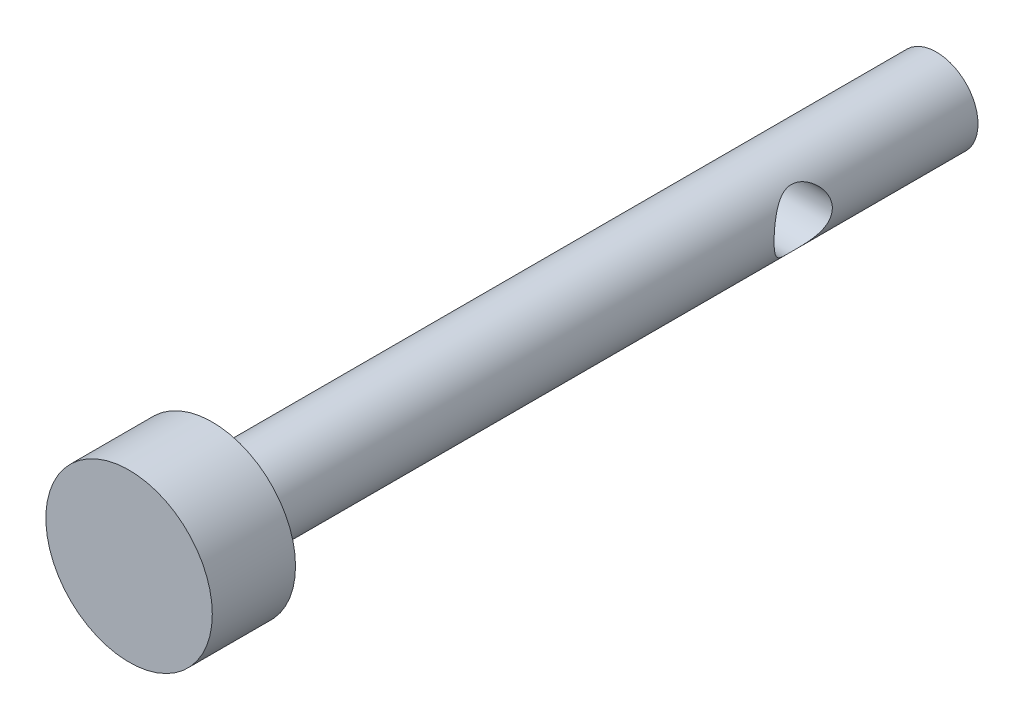
ISO-10303-21;
HEADER;
FILE_DESCRIPTION(('STEP AP214'),'2;1');
FILE_NAME('part.step','',(''),(''),'','','');
FILE_SCHEMA(('AUTOMOTIVE_DESIGN { 1 0 10303 214 1 1 1 1 }'));
ENDSEC;
DATA;
#1=APPLICATION_CONTEXT('core data for automotive mechanical design processes');
#2=APPLICATION_PROTOCOL_DEFINITION('international standard','automotive_design',2000,#1);
#3=PRODUCT_CONTEXT('',#1,'mechanical');
#4=PRODUCT('Part','Part','',(#3));
#5=PRODUCT_RELATED_PRODUCT_CATEGORY('part','',(#4));
#6=PRODUCT_DEFINITION_FORMATION('','',#4);
#7=PRODUCT_DEFINITION_CONTEXT('part definition',#1,'design');
#8=PRODUCT_DEFINITION('design','',#6,#7);
#9=PRODUCT_DEFINITION_SHAPE('','',#8);
#10=(LENGTH_UNIT() NAMED_UNIT(*) SI_UNIT(.MILLI.,.METRE.));
#11=(NAMED_UNIT(*) PLANE_ANGLE_UNIT() SI_UNIT($,.RADIAN.));
#12=(NAMED_UNIT(*) SI_UNIT($,.STERADIAN.) SOLID_ANGLE_UNIT());
#13=UNCERTAINTY_MEASURE_WITH_UNIT(LENGTH_MEASURE(1.E-05),#10,'distance_accuracy_value','');
#14=(GEOMETRIC_REPRESENTATION_CONTEXT(3) GLOBAL_UNCERTAINTY_ASSIGNED_CONTEXT((#13)) GLOBAL_UNIT_ASSIGNED_CONTEXT((#10,
#11,#12)) REPRESENTATION_CONTEXT('',''));
#15=CARTESIAN_POINT('',(0.,0.,0.));
#16=DIRECTION('',(0.,0.,1.));
#17=DIRECTION('',(1.,0.,0.));
#18=AXIS2_PLACEMENT_3D('',#15,#16,#17);
#19=CARTESIAN_POINT('',(0.,0.,43.5));
#20=DIRECTION('',(0.,0.,-1.));
#21=DIRECTION('',(-1.,0.,0.));
#22=AXIS2_PLACEMENT_3D('',#19,#20,#21);
#23=CYLINDRICAL_SURFACE('',#22,2.5);
#24=CARTESIAN_POINT('',(-2.5,0.,12.25));
#25=CARTESIAN_POINT('',(-2.50000417935183,-0.0870272806306658,12.2500045149887));
#26=CARTESIAN_POINT('',(-2.49541947341673,-0.174031326333127,12.2434745046267));
#27=CARTESIAN_POINT('',(-2.47754380094948,-0.345233801984744,12.2177916983242));
#28=CARTESIAN_POINT('',(-2.46425025749596,-0.429431393760087,12.1986351662201));
#29=CARTESIAN_POINT('',(-2.43024703487298,-0.592281042560753,12.1489167404495));
#30=CARTESIAN_POINT('',(-2.40957325629009,-0.670957776263426,12.1184100290487));
#31=CARTESIAN_POINT('',(-2.36242684544264,-0.821695911528301,12.0473418517508));
#32=CARTESIAN_POINT('',(-2.33595336701336,-0.893756345606141,12.0067789185571));
#33=CARTESIAN_POINT('',(-2.27647320252162,-1.03641560463564,11.9128938780296));
#34=CARTESIAN_POINT('',(-2.24309600217931,-1.10632319491597,11.8587612712889));
#35=CARTESIAN_POINT('',(-2.17394550601552,-1.23669715287751,11.7412878976944));
#36=CARTESIAN_POINT('',(-2.13816866805864,-1.29714910435031,11.6779333494161));
#37=CARTESIAN_POINT('',(-2.06053397834969,-1.41781427267964,11.5309612662512));
#38=CARTESIAN_POINT('',(-2.01871447556133,-1.47611164382057,11.4457400365667));
#39=CARTESIAN_POINT('',(-1.94043963297497,-1.57759082341184,11.2644942617342));
#40=CARTESIAN_POINT('',(-1.90397538152149,-1.62079791257541,11.168488144673));
#41=CARTESIAN_POINT('',(-1.85242205195633,-1.67915256528645,10.9983173413232));
#42=CARTESIAN_POINT('',(-1.83421297133124,-1.69884832135903,10.9266691292954));
#43=CARTESIAN_POINT('',(-1.80575433463996,-1.72907203628411,10.7799864428518));
#44=CARTESIAN_POINT('',(-1.79548920088628,-1.73961794248753,10.7049589025934));
#45=CARTESIAN_POINT('',(-1.78453095722031,-1.75086279441853,10.5530029710237));
#46=CARTESIAN_POINT('',(-1.78389273646174,-1.75150527487184,10.4760661830345));
#47=CARTESIAN_POINT('',(-1.79245352676614,-1.74273962160413,10.3233032755801));
#48=CARTESIAN_POINT('',(-1.8016593036704,-1.73332457528645,10.2474779563661));
#49=CARTESIAN_POINT('',(-1.82745212803341,-1.70608725233638,10.1040860486982));
#50=CARTESIAN_POINT('',(-1.84351175163694,-1.68886104404552,10.0363047116314));
#51=CARTESIAN_POINT('',(-1.88095725913183,-1.64705421369852,9.90460633820458));
#52=CARTESIAN_POINT('',(-1.90234741085843,-1.62246769549202,9.8406924494863));
#53=CARTESIAN_POINT('',(-1.9608517926034,-1.55181144069601,9.68443482685895));
#54=CARTESIAN_POINT('',(-2.0002912082621,-1.50126200550716,9.59497715159813));
#55=CARTESIAN_POINT('',(-2.0817691756418,-1.38608679529025,9.42683757338016));
#56=CARTESIAN_POINT('',(-2.12381288681897,-1.32143239343209,9.34817812285752));
#57=CARTESIAN_POINT('',(-2.20659860006416,-1.17807504752487,9.20182926175787));
#58=CARTESIAN_POINT('',(-2.24731915217641,-1.09921404998082,9.13428156601299));
#59=CARTESIAN_POINT('',(-2.32285537425778,-0.928963688177398,9.01326418749559));
#60=CARTESIAN_POINT('',(-2.35768323048681,-0.837600904087231,8.9597653215744));
#61=CARTESIAN_POINT('',(-2.41108315956312,-0.665516739683431,8.87934979276095));
#62=CARTESIAN_POINT('',(-2.43154675521247,-0.58690661890795,8.84917132612814));
#63=CARTESIAN_POINT('',(-2.46505005792204,-0.424695909314234,8.80020778432347));
#64=CARTESIAN_POINT('',(-2.47809482110888,-0.341098762318124,8.78141494897717));
#65=CARTESIAN_POINT('',(-2.49563204406047,-0.17080079115281,8.75622184979019));
#66=CARTESIAN_POINT('',(-2.50008980235338,-0.0840888101697014,8.74987186775378));
#67=CARTESIAN_POINT('',(-2.49990747395293,0.0893077388880795,8.7501320232454));
#68=CARTESIAN_POINT('',(-2.49526779830962,0.175992308024308,8.75674157522182));
#69=CARTESIAN_POINT('',(-2.4779415412315,0.340939345526249,8.78163858573414));
#70=CARTESIAN_POINT('',(-2.46579983422277,0.419382270911766,8.79913583315913));
#71=CARTESIAN_POINT('',(-2.4349433696278,0.57193808705766,8.84418665033377));
#72=CARTESIAN_POINT('',(-2.41622738595171,0.646050167114573,8.87174209595545));
#73=CARTESIAN_POINT('',(-2.37201203552655,0.79366900007705,8.93807925721198));
#74=CARTESIAN_POINT('',(-2.34612667674836,0.866762619038734,8.9775168609928));
#75=CARTESIAN_POINT('',(-2.29009123411949,1.00553102651502,9.06537027059859));
#76=CARTESIAN_POINT('',(-2.25993847260895,1.07120111010224,9.11379171947892));
#77=CARTESIAN_POINT('',(-2.19186051249631,1.2051169544116,9.22753020873422));
#78=CARTESIAN_POINT('',(-2.15348779684155,1.27188389332648,9.29432048673473));
#79=CARTESIAN_POINT('',(-2.07659509979641,1.3938990473957,9.43772860421718));
#80=CARTESIAN_POINT('',(-2.03807502611855,1.44913813503908,9.51435415412145));
#81=CARTESIAN_POINT('',(-1.96818423916184,1.54250374053234,9.66901126510814));
#82=CARTESIAN_POINT('',(-1.93648212076273,1.58176211114097,9.74620628406509));
#83=CARTESIAN_POINT('',(-1.879575747111,1.64898119692594,9.90757761454));
#84=CARTESIAN_POINT('',(-1.854358830637,1.6769639872125,9.99173989222863));
#85=CARTESIAN_POINT('',(-1.81845300156846,1.71574655060216,10.1481172855447));
#86=CARTESIAN_POINT('',(-1.80585711808347,1.72887719728624,10.2193051236333));
#87=CARTESIAN_POINT('',(-1.78912258576231,1.74619415538159,10.3637067088704));
#88=CARTESIAN_POINT('',(-1.78497297565372,1.7503920597094,10.4369177051383));
#89=CARTESIAN_POINT('',(-1.78579858784421,1.74954943123305,10.5833200990521));
#90=CARTESIAN_POINT('',(-1.79078477427084,1.74449779780213,10.6565113675771));
#91=CARTESIAN_POINT('',(-1.80908240910004,1.72551030533985,10.8007017225225));
#92=CARTESIAN_POINT('',(-1.82240601491834,1.71156147206043,10.871697448532));
#93=CARTESIAN_POINT('',(-1.86023331257333,1.67048095278779,11.0295230514212));
#94=CARTESIAN_POINT('',(-1.88683222043298,1.64073809905303,11.1151591842471));
#95=CARTESIAN_POINT('',(-1.94640956515886,1.56959792590753,11.2790225466749));
#96=CARTESIAN_POINT('',(-1.97939789114784,1.5281824946283,11.3572380078033));
#97=CARTESIAN_POINT('',(-2.04891130247937,1.43369647433305,11.5075078345549));
#98=CARTESIAN_POINT('',(-2.08550185606105,1.3803720539687,11.5793713658863));
#99=CARTESIAN_POINT('',(-2.15840763229013,1.26334356222075,11.7142649919782));
#100=CARTESIAN_POINT('',(-2.19472275970071,1.19963605778965,11.7772921522287));
#101=CARTESIAN_POINT('',(-2.2707913116056,1.04967102347159,11.9042912804869));
#102=CARTESIAN_POINT('',(-2.30994878795957,0.96142109045166,11.9663052410749));
#103=CARTESIAN_POINT('',(-2.37979805490242,0.772440104586855,12.0740443214951));
#104=CARTESIAN_POINT('',(-2.41049971586719,0.671723804436623,12.1197884512521));
#105=CARTESIAN_POINT('',(-2.45586784186854,0.476636132930743,12.1865011560205));
#106=CARTESIAN_POINT('',(-2.47225293880968,0.383593695611013,12.2101635271712));
#107=CARTESIAN_POINT('',(-2.49430986262131,0.193687895295081,12.2419004993204));
#108=CARTESIAN_POINT('',(-2.49999534990845,0.0968295657403745,12.2499949764672));
#109=CARTESIAN_POINT('',(-2.5,0.,12.25));
#110=B_SPLINE_CURVE_WITH_KNOTS('',3,(#24,#25,#26,#27,#28,#29,#30,#31,#32,#33,#34,#35,#36,#37,
#38,#39,#40,#41,#42,#43,#44,#45,#46,#47,#48,#49,#50,#51,#52,#53,#54,#55,#56,#57,#58,#59,#60,#61,
#62,#63,#64,#65,#66,#67,#68,#69,#70,#71,#72,#73,#74,#75,#76,#77,#78,#79,#80,#81,#82,#83,#84,#85,
#86,#87,#88,#89,#90,#91,#92,#93,#94,#95,#96,#97,#98,#99,#100,#101,#102,#103,#104,#105,#106,#107,
#108,#109),.UNSPECIFIED.,.T.,.F.,(4,2,2,2,2,2,2,2,2,2,2,2,2,2,2,2,2,2,2,2,2,2,2,2,2,2,2,2,2,2,2,
2,2,2,2,2,2,2,2,2,2,2,4),(0.,0.260691779269079,0.521460731389292,0.780978101362159,
1.04053335965115,1.32301333452968,1.605919870734,1.93863463581597,2.27078930038452,
2.49943939217371,2.72763996822686,2.95714117224209,3.18680021531933,3.40129749690536,
3.61596706851562,3.94441405320528,4.27353394611449,4.6065711958828,4.93891106625195,
5.19779533293352,5.45650295119186,5.71625387326353,5.97599305926016,6.21878245878817,
6.46161716213053,6.72161784328113,6.98178239593968,7.28642204868669,7.59130200116371,
7.86700091099151,8.14215740932882,8.36165195383568,8.58086146406301,8.80033422615653,
9.02012776606562,9.30202193352867,9.58435593596874,9.87340651252978,10.1625528549551,
10.5048761847685,10.8467982144163,11.1372239593292,11.4272786593701),.UNSPECIFIED.);
#111=CARTESIAN_POINT('',(-2.5,0.,12.25));
#112=VERTEX_POINT('',#111);
#113=EDGE_CURVE('E41',#112,#112,#110,.T.);
#114=ORIENTED_EDGE('',*,*,#113,.T.);
#115=EDGE_LOOP('',(#114));
#116=FACE_BOUND('',#115,.T.);
#117=CARTESIAN_POINT('',(2.5,0.,8.75));
#118=CARTESIAN_POINT('',(2.50000417935183,-0.0870272806306657,8.74999548501125));
#119=CARTESIAN_POINT('',(2.49541947341673,-0.174031326333127,8.75652549537331));
#120=CARTESIAN_POINT('',(2.47754380094948,-0.345233801984744,8.78220830167577));
#121=CARTESIAN_POINT('',(2.46425025749596,-0.429431393760087,8.80136483377989));
#122=CARTESIAN_POINT('',(2.43024703487298,-0.592281042560753,8.85108325955049));
#123=CARTESIAN_POINT('',(2.40957325629009,-0.670957776263426,8.88158997095134));
#124=CARTESIAN_POINT('',(2.36242684544264,-0.821695911528301,8.95265814824922));
#125=CARTESIAN_POINT('',(2.33595336701336,-0.893756345606141,8.9932210814429));
#126=CARTESIAN_POINT('',(2.27647320252162,-1.03641560463564,9.08710612197041));
#127=CARTESIAN_POINT('',(2.24309600217931,-1.10632319491597,9.14123872871107));
#128=CARTESIAN_POINT('',(2.17394550601552,-1.23669715287751,9.25871210230563));
#129=CARTESIAN_POINT('',(2.13816866805864,-1.29714910435031,9.3220666505839));
#130=CARTESIAN_POINT('',(2.06053397834969,-1.41781427267964,9.46903873374882));
#131=CARTESIAN_POINT('',(2.01871447556133,-1.47611164382057,9.55425996343334));
#132=CARTESIAN_POINT('',(1.94043963297497,-1.57759082341184,9.73550573826581));
#133=CARTESIAN_POINT('',(1.90397538152149,-1.62079791257541,9.83151185532697));
#134=CARTESIAN_POINT('',(1.85242205195633,-1.67915256528645,10.0016826586768));
#135=CARTESIAN_POINT('',(1.83421297133124,-1.69884832135903,10.0733308707046));
#136=CARTESIAN_POINT('',(1.80575433463996,-1.72907203628411,10.2200135571482));
#137=CARTESIAN_POINT('',(1.79548920088628,-1.73961794248753,10.2950410974066));
#138=CARTESIAN_POINT('',(1.78453095722031,-1.75086279441853,10.4469970289763));
#139=CARTESIAN_POINT('',(1.78389273646174,-1.75150527487184,10.5239338169655));
#140=CARTESIAN_POINT('',(1.79245352676614,-1.74273962160413,10.6766967244199));
#141=CARTESIAN_POINT('',(1.8016593036704,-1.73332457528645,10.7525220436339));
#142=CARTESIAN_POINT('',(1.82745212803341,-1.70608725233638,10.8959139513018));
#143=CARTESIAN_POINT('',(1.84351175163694,-1.68886104404552,10.9636952883686));
#144=CARTESIAN_POINT('',(1.88095725913183,-1.64705421369852,11.0953936617954));
#145=CARTESIAN_POINT('',(1.90234741085843,-1.62246769549202,11.1593075505137));
#146=CARTESIAN_POINT('',(1.9608517926034,-1.55181144069601,11.315565173141));
#147=CARTESIAN_POINT('',(2.0002912082621,-1.50126200550716,11.4050228484019));
#148=CARTESIAN_POINT('',(2.0817691756418,-1.38608679529025,11.5731624266198));
#149=CARTESIAN_POINT('',(2.12381288681897,-1.32143239343209,11.6518218771425));
#150=CARTESIAN_POINT('',(2.20659860006416,-1.17807504752487,11.7981707382421));
#151=CARTESIAN_POINT('',(2.24731915217641,-1.09921404998082,11.865718433987));
#152=CARTESIAN_POINT('',(2.32285537425778,-0.928963688177398,11.9867358125044));
#153=CARTESIAN_POINT('',(2.35768323048681,-0.837600904087231,12.0402346784256));
#154=CARTESIAN_POINT('',(2.41108315956312,-0.665516739683431,12.120650207239));
#155=CARTESIAN_POINT('',(2.43154675521247,-0.58690661890795,12.1508286738718));
#156=CARTESIAN_POINT('',(2.46505005792204,-0.424695909314233,12.1997922156765));
#157=CARTESIAN_POINT('',(2.47809482110888,-0.341098762318124,12.2185850510228));
#158=CARTESIAN_POINT('',(2.49563204406047,-0.17080079115281,12.2437781502098));
#159=CARTESIAN_POINT('',(2.50008980235338,-0.0840888101697014,12.2501281322462));
#160=CARTESIAN_POINT('',(2.49990747395293,0.0893077388880795,12.2498679767546));
#161=CARTESIAN_POINT('',(2.49526779830962,0.175992308024308,12.2432584247782));
#162=CARTESIAN_POINT('',(2.4779415412315,0.340939345526249,12.2183614142659));
#163=CARTESIAN_POINT('',(2.46579983422277,0.419382270911766,12.2008641668409));
#164=CARTESIAN_POINT('',(2.4349433696278,0.57193808705766,12.1558133496662));
#165=CARTESIAN_POINT('',(2.41622738595171,0.646050167114573,12.1282579040445));
#166=CARTESIAN_POINT('',(2.37201203552655,0.79366900007705,12.061920742788));
#167=CARTESIAN_POINT('',(2.34612667674836,0.866762619038734,12.0224831390072));
#168=CARTESIAN_POINT('',(2.29009123411949,1.00553102651502,11.9346297294014));
#169=CARTESIAN_POINT('',(2.25993847260895,1.07120111010224,11.8862082805211));
#170=CARTESIAN_POINT('',(2.19186051249631,1.2051169544116,11.7724697912658));
#171=CARTESIAN_POINT('',(2.15348779684155,1.27188389332648,11.7056795132653));
#172=CARTESIAN_POINT('',(2.07659509979641,1.39389904739571,11.5622713957828));
#173=CARTESIAN_POINT('',(2.03807502611855,1.44913813503908,11.4856458458785));
#174=CARTESIAN_POINT('',(1.96818423916184,1.54250374053234,11.3309887348919));
#175=CARTESIAN_POINT('',(1.93648212076273,1.58176211114097,11.2537937159349));
#176=CARTESIAN_POINT('',(1.879575747111,1.64898119692594,11.09242238546));
#177=CARTESIAN_POINT('',(1.854358830637,1.6769639872125,11.0082601077714));
#178=CARTESIAN_POINT('',(1.81845300156846,1.71574655060216,10.8518827144553));
#179=CARTESIAN_POINT('',(1.80585711808347,1.72887719728624,10.7806948763667));
#180=CARTESIAN_POINT('',(1.78912258576231,1.74619415538159,10.6362932911296));
#181=CARTESIAN_POINT('',(1.78497297565372,1.7503920597094,10.5630822948617));
#182=CARTESIAN_POINT('',(1.78579858784421,1.74954943123305,10.4166799009479));
#183=CARTESIAN_POINT('',(1.79078477427084,1.74449779780213,10.3434886324228));
#184=CARTESIAN_POINT('',(1.80908240910004,1.72551030533985,10.1992982774775));
#185=CARTESIAN_POINT('',(1.82240601491834,1.71156147206043,10.128302551468));
#186=CARTESIAN_POINT('',(1.86023331257333,1.67048095278779,9.97047694857876));
#187=CARTESIAN_POINT('',(1.88683222043298,1.64073809905303,9.88484081575289));
#188=CARTESIAN_POINT('',(1.94640956515886,1.56959792590753,9.72097745332504));
#189=CARTESIAN_POINT('',(1.97939789114784,1.5281824946283,9.6427619921967));
#190=CARTESIAN_POINT('',(2.04891130247937,1.43369647433305,9.49249216544512));
#191=CARTESIAN_POINT('',(2.08550185606105,1.3803720539687,9.42062863411367));
#192=CARTESIAN_POINT('',(2.15840763229013,1.26334356222075,9.28573500802175));
#193=CARTESIAN_POINT('',(2.19472275970071,1.19963605778965,9.22270784777126));
#194=CARTESIAN_POINT('',(2.2707913116056,1.04967102347159,9.09570871951306));
#195=CARTESIAN_POINT('',(2.30994878795957,0.96142109045166,9.03369475892505));
#196=CARTESIAN_POINT('',(2.37979805490242,0.772440104586855,8.92595567850492));
#197=CARTESIAN_POINT('',(2.41049971586719,0.671723804436623,8.88021154874792));
#198=CARTESIAN_POINT('',(2.45586784186854,0.476636132930744,8.81349884397951));
#199=CARTESIAN_POINT('',(2.47225293880968,0.383593695611014,8.78983647282874));
#200=CARTESIAN_POINT('',(2.49430986262131,0.193687895295081,8.75809950067957));
#201=CARTESIAN_POINT('',(2.49999534990845,0.0968295657403749,8.7500050235328));
#202=CARTESIAN_POINT('',(2.5,0.,8.75));
#203=B_SPLINE_CURVE_WITH_KNOTS('',3,(#117,#118,#119,#120,#121,#122,#123,#124,#125,#126,#127,
#128,#129,#130,#131,#132,#133,#134,#135,#136,#137,#138,#139,#140,#141,#142,#143,#144,#145,#146,
#147,#148,#149,#150,#151,#152,#153,#154,#155,#156,#157,#158,#159,#160,#161,#162,#163,#164,#165,
#166,#167,#168,#169,#170,#171,#172,#173,#174,#175,#176,#177,#178,#179,#180,#181,#182,#183,#184,
#185,#186,#187,#188,#189,#190,#191,#192,#193,#194,#195,#196,#197,#198,#199,#200,#201,#202),
.UNSPECIFIED.,.T.,.F.,(4,2,2,2,2,2,2,2,2,2,2,2,2,2,2,2,2,2,2,2,2,2,2,2,2,2,2,2,2,2,2,2,2,2,2,2,
2,2,2,2,2,2,4),(0.,0.260691779269079,0.521460731389292,0.78097810136216,1.04053335965115,
1.32301333452968,1.605919870734,1.93863463581597,2.27078930038452,2.49943939217371,
2.72763996822686,2.95714117224209,3.18680021531933,3.40129749690536,3.61596706851562,
3.94441405320528,4.27353394611449,4.6065711958828,4.93891106625195,5.19779533293352,
5.45650295119186,5.71625387326353,5.97599305926016,6.21878245878817,6.46161716213053,
6.72161784328113,6.98178239593968,7.28642204868669,7.59130200116371,7.86700091099151,
8.14215740932882,8.36165195383568,8.58086146406301,8.80033422615653,9.02012776606562,
9.30202193352867,9.58435593596874,9.87340651252978,10.1625528549551,10.5048761847685,
10.8467982144163,11.1372239593292,11.4272786593701),.UNSPECIFIED.);
#204=CARTESIAN_POINT('',(2.5,0.,8.75));
#205=VERTEX_POINT('',#204);
#206=EDGE_CURVE('E59',#205,#205,#203,.T.);
#207=ORIENTED_EDGE('',*,*,#206,.T.);
#208=EDGE_LOOP('',(#207));
#209=FACE_BOUND('',#208,.T.);
#210=CARTESIAN_POINT('',(0.,0.,43.5));
#211=DIRECTION('',(0.,0.,1.));
#212=DIRECTION('',(1.,0.,0.));
#213=AXIS2_PLACEMENT_3D('',#210,#211,#212);
#214=CIRCLE('',#213,2.5);
#215=CARTESIAN_POINT('',(2.5,0.,43.5));
#216=VERTEX_POINT('',#215);
#217=EDGE_CURVE('E10',#216,#216,#214,.T.);
#218=ORIENTED_EDGE('',*,*,#217,.F.);
#219=EDGE_LOOP('',(#218));
#220=FACE_BOUND('',#219,.T.);
#221=CARTESIAN_POINT('',(0.,0.,0.));
#222=DIRECTION('',(0.,0.,1.));
#223=DIRECTION('',(1.,0.,0.));
#224=AXIS2_PLACEMENT_3D('',#221,#222,#223);
#225=CIRCLE('',#224,2.5);
#226=CARTESIAN_POINT('',(2.5,0.,0.));
#227=VERTEX_POINT('',#226);
#228=EDGE_CURVE('E49',#227,#227,#225,.T.);
#229=ORIENTED_EDGE('',*,*,#228,.T.);
#230=EDGE_LOOP('',(#229));
#231=FACE_BOUND('',#230,.T.);
#232=ADVANCED_FACE('F37',(#116,#209,#220,#231),#23,.T.);
#233=CARTESIAN_POINT('',(0.,0.,0.));
#234=DIRECTION('',(0.,0.,1.));
#235=DIRECTION('',(1.,0.,0.));
#236=AXIS2_PLACEMENT_3D('',#233,#234,#235);
#237=PLANE('',#236);
#238=ORIENTED_EDGE('',*,*,#228,.F.);
#239=EDGE_LOOP('',(#238));
#240=FACE_BOUND('',#239,.T.);
#241=ADVANCED_FACE('F79',(#240),#237,.F.);
#242=CARTESIAN_POINT('',(0.,0.,48.5));
#243=DIRECTION('',(0.,0.,-1.));
#244=DIRECTION('',(-1.,0.,0.));
#245=AXIS2_PLACEMENT_3D('',#242,#243,#244);
#246=CYLINDRICAL_SURFACE('',#245,5.);
#247=CARTESIAN_POINT('',(0.,0.,48.5));
#248=DIRECTION('',(0.,0.,1.));
#249=DIRECTION('',(1.,0.,0.));
#250=AXIS2_PLACEMENT_3D('',#247,#248,#249);
#251=CIRCLE('',#250,5.);
#252=CARTESIAN_POINT('',(5.,0.,48.5));
#253=VERTEX_POINT('',#252);
#254=EDGE_CURVE('E54',#253,#253,#251,.T.);
#255=ORIENTED_EDGE('',*,*,#254,.F.);
#256=EDGE_LOOP('',(#255));
#257=FACE_BOUND('',#256,.T.);
#258=CARTESIAN_POINT('',(0.,0.,43.5));
#259=DIRECTION('',(0.,0.,1.));
#260=DIRECTION('',(1.,0.,0.));
#261=AXIS2_PLACEMENT_3D('',#258,#259,#260);
#262=CIRCLE('',#261,5.);
#263=CARTESIAN_POINT('',(5.,0.,43.5));
#264=VERTEX_POINT('',#263);
#265=EDGE_CURVE('E57',#264,#264,#262,.T.);
#266=ORIENTED_EDGE('',*,*,#265,.T.);
#267=EDGE_LOOP('',(#266));
#268=FACE_BOUND('',#267,.T.);
#269=ADVANCED_FACE('F74',(#257,#268),#246,.T.);
#270=CARTESIAN_POINT('',(0.,0.,48.5));
#271=DIRECTION('',(0.,0.,1.));
#272=DIRECTION('',(1.,0.,0.));
#273=AXIS2_PLACEMENT_3D('',#270,#271,#272);
#274=PLANE('',#273);
#275=ORIENTED_EDGE('',*,*,#254,.T.);
#276=EDGE_LOOP('',(#275));
#277=FACE_BOUND('',#276,.T.);
#278=ADVANCED_FACE('F70',(#277),#274,.T.);
#279=CARTESIAN_POINT('',(0.,0.,43.5));
#280=DIRECTION('',(0.,0.,1.));
#281=DIRECTION('',(1.,0.,0.));
#282=AXIS2_PLACEMENT_3D('',#279,#280,#281);
#283=PLANE('',#282);
#284=ORIENTED_EDGE('',*,*,#217,.T.);
#285=EDGE_LOOP('',(#284));
#286=FACE_BOUND('',#285,.T.);
#287=ORIENTED_EDGE('',*,*,#265,.F.);
#288=EDGE_LOOP('',(#287));
#289=FACE_BOUND('',#288,.T.);
#290=ADVANCED_FACE('F68',(#286,#289),#283,.F.);
#291=CARTESIAN_POINT('',(-10.,0.,10.5));
#292=DIRECTION('',(1.,0.,0.));
#293=DIRECTION('',(0.,0.,-1.));
#294=AXIS2_PLACEMENT_3D('',#291,#292,#293);
#295=CYLINDRICAL_SURFACE('',#294,1.75);
#296=ORIENTED_EDGE('',*,*,#206,.F.);
#297=EDGE_LOOP('',(#296));
#298=FACE_BOUND('',#297,.T.);
#299=ORIENTED_EDGE('',*,*,#113,.F.);
#300=EDGE_LOOP('',(#299));
#301=FACE_BOUND('',#300,.T.);
#302=ADVANCED_FACE('F64',(#298,#301),#295,.F.);
#303=CLOSED_SHELL('',(#232,#241,#269,#278,#290,#302));
#304=MANIFOLD_SOLID_BREP('B2',#303);
#305=ADVANCED_BREP_SHAPE_REPRESENTATION('',(#18,#304),#14);
#306=SHAPE_DEFINITION_REPRESENTATION(#9,#305);
ENDSEC;
END-ISO-10303-21;
